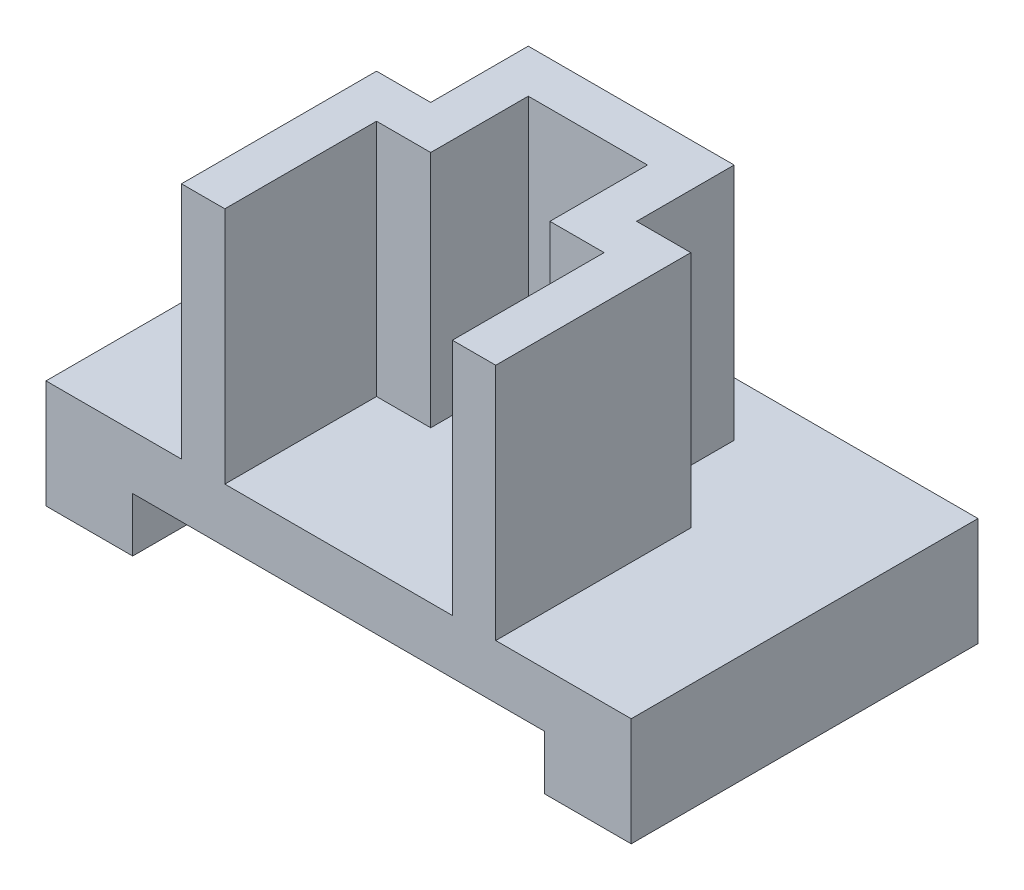
ISO-10303-21;
HEADER;
FILE_DESCRIPTION(('STEP AP214'),'2;1');
FILE_NAME('part.step','',(''),(''),'','','');
FILE_SCHEMA(('AUTOMOTIVE_DESIGN { 1 0 10303 214 1 1 1 1 }'));
ENDSEC;
DATA;
#1=APPLICATION_CONTEXT('core data for automotive mechanical design processes');
#2=APPLICATION_PROTOCOL_DEFINITION('international standard','automotive_design',2000,#1);
#3=PRODUCT_CONTEXT('',#1,'mechanical');
#4=PRODUCT('Part','Part','',(#3));
#5=PRODUCT_RELATED_PRODUCT_CATEGORY('part','',(#4));
#6=PRODUCT_DEFINITION_FORMATION('','',#4);
#7=PRODUCT_DEFINITION_CONTEXT('part definition',#1,'design');
#8=PRODUCT_DEFINITION('design','',#6,#7);
#9=PRODUCT_DEFINITION_SHAPE('','',#8);
#10=(LENGTH_UNIT() NAMED_UNIT(*) SI_UNIT(.MILLI.,.METRE.));
#11=(NAMED_UNIT(*) PLANE_ANGLE_UNIT() SI_UNIT($,.RADIAN.));
#12=(NAMED_UNIT(*) SI_UNIT($,.STERADIAN.) SOLID_ANGLE_UNIT());
#13=UNCERTAINTY_MEASURE_WITH_UNIT(LENGTH_MEASURE(1.E-05),#10,'distance_accuracy_value','');
#14=(GEOMETRIC_REPRESENTATION_CONTEXT(3) GLOBAL_UNCERTAINTY_ASSIGNED_CONTEXT((#13)) GLOBAL_UNIT_ASSIGNED_CONTEXT((#10,
#11,#12)) REPRESENTATION_CONTEXT('',''));
#15=CARTESIAN_POINT('',(0.,0.,0.));
#16=DIRECTION('',(0.,0.,1.));
#17=DIRECTION('',(1.,0.,0.));
#18=AXIS2_PLACEMENT_3D('',#15,#16,#17);
#19=CARTESIAN_POINT('',(-27.,5.,32.));
#20=DIRECTION('',(0.,-1.,0.));
#21=DIRECTION('',(0.,0.,-1.));
#22=AXIS2_PLACEMENT_3D('',#19,#20,#21);
#23=PLANE('',#22);
#24=DIRECTION('',(0.,0.,1.));
#25=VECTOR('',#24,1.);
#26=CARTESIAN_POINT('',(-14.5,5.,32.));
#27=LINE('',#26,#25);
#28=CARTESIAN_POINT('',(-14.5,5.,14.));
#29=VERTEX_POINT('',#28);
#30=CARTESIAN_POINT('',(-14.5,5.,32.));
#31=VERTEX_POINT('',#30);
#32=EDGE_CURVE('E61',#29,#31,#27,.T.);
#33=ORIENTED_EDGE('',*,*,#32,.F.);
#34=DIRECTION('',(-1.,0.,0.));
#35=VECTOR('',#34,1.);
#36=CARTESIAN_POINT('',(-14.5,5.,14.));
#37=LINE('',#36,#35);
#38=CARTESIAN_POINT('',(-9.5,5.,14.));
#39=VERTEX_POINT('',#38);
#40=EDGE_CURVE('E65',#39,#29,#37,.T.);
#41=ORIENTED_EDGE('',*,*,#40,.F.);
#42=DIRECTION('',(0.,0.,1.));
#43=VECTOR('',#42,1.);
#44=CARTESIAN_POINT('',(-9.5,5.,14.));
#45=LINE('',#44,#43);
#46=CARTESIAN_POINT('',(-9.5,5.,5.));
#47=VERTEX_POINT('',#46);
#48=EDGE_CURVE('E435',#47,#39,#45,.T.);
#49=ORIENTED_EDGE('',*,*,#48,.F.);
#50=DIRECTION('',(-1.,0.,0.));
#51=VECTOR('',#50,1.);
#52=CARTESIAN_POINT('',(-9.5,5.,5.));
#53=LINE('',#52,#51);
#54=CARTESIAN_POINT('',(9.5,5.,5.));
#55=VERTEX_POINT('',#54);
#56=EDGE_CURVE('E431',#55,#47,#53,.T.);
#57=ORIENTED_EDGE('',*,*,#56,.F.);
#58=DIRECTION('',(0.,0.,-1.));
#59=VECTOR('',#58,1.);
#60=CARTESIAN_POINT('',(9.5,5.,14.));
#61=LINE('',#60,#59);
#62=CARTESIAN_POINT('',(9.5,5.,14.));
#63=VERTEX_POINT('',#62);
#64=EDGE_CURVE('E427',#63,#55,#61,.T.);
#65=ORIENTED_EDGE('',*,*,#64,.F.);
#66=DIRECTION('',(-1.,0.,0.));
#67=VECTOR('',#66,1.);
#68=CARTESIAN_POINT('',(14.5,5.,14.));
#69=LINE('',#68,#67);
#70=CARTESIAN_POINT('',(14.5,5.,14.));
#71=VERTEX_POINT('',#70);
#72=EDGE_CURVE('E423',#71,#63,#69,.T.);
#73=ORIENTED_EDGE('',*,*,#72,.F.);
#74=DIRECTION('',(0.,0.,-1.));
#75=VECTOR('',#74,1.);
#76=CARTESIAN_POINT('',(14.5,5.,32.));
#77=LINE('',#76,#75);
#78=CARTESIAN_POINT('',(14.5,5.,32.));
#79=VERTEX_POINT('',#78);
#80=EDGE_CURVE('E419',#79,#71,#77,.T.);
#81=ORIENTED_EDGE('',*,*,#80,.F.);
#82=DIRECTION('',(-1.,0.,0.));
#83=VECTOR('',#82,1.);
#84=CARTESIAN_POINT('',(-27.,5.,32.));
#85=LINE('',#84,#83);
#86=CARTESIAN_POINT('',(27.,5.,32.));
#87=VERTEX_POINT('',#86);
#88=EDGE_CURVE('E253',#87,#79,#85,.T.);
#89=ORIENTED_EDGE('',*,*,#88,.F.);
#90=DIRECTION('',(0.,0.,-1.));
#91=VECTOR('',#90,1.);
#92=CARTESIAN_POINT('',(27.,5.,32.));
#93=LINE('',#92,#91);
#94=CARTESIAN_POINT('',(27.,5.,0.));
#95=VERTEX_POINT('',#94);
#96=EDGE_CURVE('E309',#87,#95,#93,.T.);
#97=ORIENTED_EDGE('',*,*,#96,.T.);
#98=DIRECTION('',(-1.,0.,0.));
#99=VECTOR('',#98,1.);
#100=CARTESIAN_POINT('',(-27.,5.,0.));
#101=LINE('',#100,#99);
#102=CARTESIAN_POINT('',(-27.,5.,0.));
#103=VERTEX_POINT('',#102);
#104=EDGE_CURVE('E276',#95,#103,#101,.T.);
#105=ORIENTED_EDGE('',*,*,#104,.T.);
#106=DIRECTION('',(0.,0.,-1.));
#107=VECTOR('',#106,1.);
#108=CARTESIAN_POINT('',(-27.,5.,32.));
#109=LINE('',#108,#107);
#110=CARTESIAN_POINT('',(-27.,5.,32.));
#111=VERTEX_POINT('',#110);
#112=EDGE_CURVE('E305',#111,#103,#109,.T.);
#113=ORIENTED_EDGE('',*,*,#112,.F.);
#114=EDGE_CURVE('E252',#31,#111,#85,.T.);
#115=ORIENTED_EDGE('',*,*,#114,.F.);
#116=EDGE_LOOP('',(#33,#41,#49,#57,#65,#73,#81,#89,#97,#105,#113,#115));
#117=FACE_BOUND('',#116,.T.);
#118=ADVANCED_FACE('F45',(#117),#23,.F.);
#119=DIRECTION('',(0.,0.,1.));
#120=VECTOR('',#119,1.);
#121=CARTESIAN_POINT('',(10.5,5.,32.));
#122=LINE('',#121,#120);
#123=CARTESIAN_POINT('',(10.5,5.,18.));
#124=VERTEX_POINT('',#123);
#125=CARTESIAN_POINT('',(10.5,5.,32.));
#126=VERTEX_POINT('',#125);
#127=EDGE_CURVE('E416',#124,#126,#122,.T.);
#128=ORIENTED_EDGE('',*,*,#127,.F.);
#129=DIRECTION('',(1.,0.,0.));
#130=VECTOR('',#129,1.);
#131=CARTESIAN_POINT('',(10.5,5.,18.));
#132=LINE('',#131,#130);
#133=CARTESIAN_POINT('',(5.5,5.,18.));
#134=VERTEX_POINT('',#133);
#135=EDGE_CURVE('E412',#134,#124,#132,.T.);
#136=ORIENTED_EDGE('',*,*,#135,.F.);
#137=DIRECTION('',(0.,0.,1.));
#138=VECTOR('',#137,1.);
#139=CARTESIAN_POINT('',(5.5,5.,18.));
#140=LINE('',#139,#138);
#141=CARTESIAN_POINT('',(5.5,5.,9.));
#142=VERTEX_POINT('',#141);
#143=EDGE_CURVE('E408',#142,#134,#140,.T.);
#144=ORIENTED_EDGE('',*,*,#143,.F.);
#145=DIRECTION('',(1.,0.,0.));
#146=VECTOR('',#145,1.);
#147=CARTESIAN_POINT('',(-5.5,5.,9.));
#148=LINE('',#147,#146);
#149=CARTESIAN_POINT('',(-5.5,5.,9.));
#150=VERTEX_POINT('',#149);
#151=EDGE_CURVE('E404',#150,#142,#148,.T.);
#152=ORIENTED_EDGE('',*,*,#151,.F.);
#153=DIRECTION('',(0.,0.,-1.));
#154=VECTOR('',#153,1.);
#155=CARTESIAN_POINT('',(-5.5,5.,18.));
#156=LINE('',#155,#154);
#157=CARTESIAN_POINT('',(-5.5,5.,18.));
#158=VERTEX_POINT('',#157);
#159=EDGE_CURVE('E400',#158,#150,#156,.T.);
#160=ORIENTED_EDGE('',*,*,#159,.F.);
#161=DIRECTION('',(1.,0.,0.));
#162=VECTOR('',#161,1.);
#163=CARTESIAN_POINT('',(-10.5,5.,18.));
#164=LINE('',#163,#162);
#165=CARTESIAN_POINT('',(-10.5,5.,18.));
#166=VERTEX_POINT('',#165);
#167=EDGE_CURVE('E396',#166,#158,#164,.T.);
#168=ORIENTED_EDGE('',*,*,#167,.F.);
#169=DIRECTION('',(0.,0.,-1.));
#170=VECTOR('',#169,1.);
#171=CARTESIAN_POINT('',(-10.5,5.,32.));
#172=LINE('',#171,#170);
#173=CARTESIAN_POINT('',(-10.5,5.,32.));
#174=VERTEX_POINT('',#173);
#175=EDGE_CURVE('E347',#174,#166,#172,.T.);
#176=ORIENTED_EDGE('',*,*,#175,.F.);
#177=EDGE_CURVE('E258',#126,#174,#85,.T.);
#178=ORIENTED_EDGE('',*,*,#177,.F.);
#179=EDGE_LOOP('',(#128,#136,#144,#152,#160,#168,#176,#178));
#180=FACE_BOUND('',#179,.T.);
#181=ADVANCED_FACE('F542',(#180),#23,.F.);
#182=CARTESIAN_POINT('',(19.,-5.,32.));
#183=DIRECTION('',(1.,0.,0.));
#184=DIRECTION('',(0.,0.,-1.));
#185=AXIS2_PLACEMENT_3D('',#182,#183,#184);
#186=PLANE('',#185);
#187=DIRECTION('',(0.,-1.,0.));
#188=VECTOR('',#187,1.);
#189=CARTESIAN_POINT('',(19.,-5.,0.));
#190=LINE('',#189,#188);
#191=CARTESIAN_POINT('',(19.,0.,0.));
#192=VERTEX_POINT('',#191);
#193=CARTESIAN_POINT('',(19.,-5.,0.));
#194=VERTEX_POINT('',#193);
#195=EDGE_CURVE('E231',#192,#194,#190,.T.);
#196=ORIENTED_EDGE('',*,*,#195,.T.);
#197=DIRECTION('',(0.,0.,-1.));
#198=VECTOR('',#197,1.);
#199=CARTESIAN_POINT('',(19.,-5.,32.));
#200=LINE('',#199,#198);
#201=CARTESIAN_POINT('',(19.,-5.,32.));
#202=VERTEX_POINT('',#201);
#203=EDGE_CURVE('E11',#202,#194,#200,.T.);
#204=ORIENTED_EDGE('',*,*,#203,.F.);
#205=DIRECTION('',(0.,-1.,0.));
#206=VECTOR('',#205,1.);
#207=CARTESIAN_POINT('',(19.,-5.,32.));
#208=LINE('',#207,#206);
#209=CARTESIAN_POINT('',(19.,0.,32.));
#210=VERTEX_POINT('',#209);
#211=EDGE_CURVE('E242',#210,#202,#208,.T.);
#212=ORIENTED_EDGE('',*,*,#211,.F.);
#213=DIRECTION('',(0.,0.,-1.));
#214=VECTOR('',#213,1.);
#215=CARTESIAN_POINT('',(19.,0.,32.));
#216=LINE('',#215,#214);
#217=EDGE_CURVE('E269',#210,#192,#216,.T.);
#218=ORIENTED_EDGE('',*,*,#217,.T.);
#219=EDGE_LOOP('',(#196,#204,#212,#218));
#220=FACE_BOUND('',#219,.T.);
#221=ADVANCED_FACE('F47',(#220),#186,.F.);
#222=CARTESIAN_POINT('',(19.,-5.,32.));
#223=DIRECTION('',(0.,1.,0.));
#224=DIRECTION('',(0.,0.,1.));
#225=AXIS2_PLACEMENT_3D('',#222,#223,#224);
#226=PLANE('',#225);
#227=DIRECTION('',(1.,0.,0.));
#228=VECTOR('',#227,1.);
#229=CARTESIAN_POINT('',(19.,-5.,0.));
#230=LINE('',#229,#228);
#231=CARTESIAN_POINT('',(27.,-5.,0.));
#232=VERTEX_POINT('',#231);
#233=EDGE_CURVE('E236',#194,#232,#230,.T.);
#234=ORIENTED_EDGE('',*,*,#233,.T.);
#235=DIRECTION('',(0.,0.,-1.));
#236=VECTOR('',#235,1.);
#237=CARTESIAN_POINT('',(27.,-5.,32.));
#238=LINE('',#237,#236);
#239=CARTESIAN_POINT('',(27.,-5.,32.));
#240=VERTEX_POINT('',#239);
#241=EDGE_CURVE('E54',#240,#232,#238,.T.);
#242=ORIENTED_EDGE('',*,*,#241,.F.);
#243=DIRECTION('',(1.,0.,0.));
#244=VECTOR('',#243,1.);
#245=CARTESIAN_POINT('',(19.,-5.,32.));
#246=LINE('',#245,#244);
#247=EDGE_CURVE('E245',#202,#240,#246,.T.);
#248=ORIENTED_EDGE('',*,*,#247,.F.);
#249=ORIENTED_EDGE('',*,*,#203,.T.);
#250=EDGE_LOOP('',(#234,#242,#248,#249));
#251=FACE_BOUND('',#250,.T.);
#252=ADVANCED_FACE('F552',(#251),#226,.F.);
#253=CARTESIAN_POINT('',(27.,-5.,32.));
#254=DIRECTION('',(-1.,0.,0.));
#255=DIRECTION('',(0.,0.,1.));
#256=AXIS2_PLACEMENT_3D('',#253,#254,#255);
#257=PLANE('',#256);
#258=DIRECTION('',(0.,1.,0.));
#259=VECTOR('',#258,1.);
#260=CARTESIAN_POINT('',(27.,-5.,0.));
#261=LINE('',#260,#259);
#262=EDGE_CURVE('E273',#232,#95,#261,.T.);
#263=ORIENTED_EDGE('',*,*,#262,.T.);
#264=ORIENTED_EDGE('',*,*,#96,.F.);
#265=DIRECTION('',(0.,1.,0.));
#266=VECTOR('',#265,1.);
#267=CARTESIAN_POINT('',(27.,-5.,32.));
#268=LINE('',#267,#266);
#269=EDGE_CURVE('E249',#240,#87,#268,.T.);
#270=ORIENTED_EDGE('',*,*,#269,.F.);
#271=ORIENTED_EDGE('',*,*,#241,.T.);
#272=EDGE_LOOP('',(#263,#264,#270,#271));
#273=FACE_BOUND('',#272,.T.);
#274=ADVANCED_FACE('F318',(#273),#257,.F.);
#275=CARTESIAN_POINT('',(-27.,-5.,32.));
#276=DIRECTION('',(1.,0.,0.));
#277=DIRECTION('',(0.,0.,-1.));
#278=AXIS2_PLACEMENT_3D('',#275,#276,#277);
#279=PLANE('',#278);
#280=DIRECTION('',(0.,-1.,0.));
#281=VECTOR('',#280,1.);
#282=CARTESIAN_POINT('',(-27.,-5.,0.));
#283=LINE('',#282,#281);
#284=CARTESIAN_POINT('',(-27.,-5.,0.));
#285=VERTEX_POINT('',#284);
#286=EDGE_CURVE('E279',#103,#285,#283,.T.);
#287=ORIENTED_EDGE('',*,*,#286,.T.);
#288=DIRECTION('',(0.,0.,-1.));
#289=VECTOR('',#288,1.);
#290=CARTESIAN_POINT('',(-27.,-5.,32.));
#291=LINE('',#290,#289);
#292=CARTESIAN_POINT('',(-27.,-5.,32.));
#293=VERTEX_POINT('',#292);
#294=EDGE_CURVE('E301',#293,#285,#291,.T.);
#295=ORIENTED_EDGE('',*,*,#294,.F.);
#296=DIRECTION('',(0.,-1.,0.));
#297=VECTOR('',#296,1.);
#298=CARTESIAN_POINT('',(-27.,-5.,32.));
#299=LINE('',#298,#297);
#300=EDGE_CURVE('E257',#111,#293,#299,.T.);
#301=ORIENTED_EDGE('',*,*,#300,.F.);
#302=ORIENTED_EDGE('',*,*,#112,.T.);
#303=EDGE_LOOP('',(#287,#295,#301,#302));
#304=FACE_BOUND('',#303,.T.);
#305=ADVANCED_FACE('F331',(#304),#279,.F.);
#306=CARTESIAN_POINT('',(-19.,-5.,32.));
#307=DIRECTION('',(0.,1.,0.));
#308=DIRECTION('',(-1.,0.,0.));
#309=AXIS2_PLACEMENT_3D('',#306,#307,#308);
#310=PLANE('',#309);
#311=DIRECTION('',(1.,0.,0.));
#312=VECTOR('',#311,1.);
#313=CARTESIAN_POINT('',(-19.,-5.,0.));
#314=LINE('',#313,#312);
#315=CARTESIAN_POINT('',(-19.,-5.,0.));
#316=VERTEX_POINT('',#315);
#317=EDGE_CURVE('E282',#285,#316,#314,.T.);
#318=ORIENTED_EDGE('',*,*,#317,.T.);
#319=DIRECTION('',(0.,0.,-1.));
#320=VECTOR('',#319,1.);
#321=CARTESIAN_POINT('',(-19.,-5.,32.));
#322=LINE('',#321,#320);
#323=CARTESIAN_POINT('',(-19.,-5.,32.));
#324=VERTEX_POINT('',#323);
#325=EDGE_CURVE('E297',#324,#316,#322,.T.);
#326=ORIENTED_EDGE('',*,*,#325,.F.);
#327=DIRECTION('',(1.,0.,0.));
#328=VECTOR('',#327,1.);
#329=CARTESIAN_POINT('',(-19.,-5.,32.));
#330=LINE('',#329,#328);
#331=EDGE_CURVE('E261',#293,#324,#330,.T.);
#332=ORIENTED_EDGE('',*,*,#331,.F.);
#333=ORIENTED_EDGE('',*,*,#294,.T.);
#334=EDGE_LOOP('',(#318,#326,#332,#333));
#335=FACE_BOUND('',#334,.T.);
#336=ADVANCED_FACE('F571',(#335),#310,.F.);
#337=CARTESIAN_POINT('',(-19.,-5.,32.));
#338=DIRECTION('',(-1.,0.,0.));
#339=DIRECTION('',(0.,0.,1.));
#340=AXIS2_PLACEMENT_3D('',#337,#338,#339);
#341=PLANE('',#340);
#342=DIRECTION('',(0.,1.,0.));
#343=VECTOR('',#342,1.);
#344=CARTESIAN_POINT('',(-19.,-5.,0.));
#345=LINE('',#344,#343);
#346=CARTESIAN_POINT('',(-19.,0.,0.));
#347=VERTEX_POINT('',#346);
#348=EDGE_CURVE('E285',#316,#347,#345,.T.);
#349=ORIENTED_EDGE('',*,*,#348,.T.);
#350=DIRECTION('',(0.,0.,-1.));
#351=VECTOR('',#350,1.);
#352=CARTESIAN_POINT('',(-19.,0.,32.));
#353=LINE('',#352,#351);
#354=CARTESIAN_POINT('',(-19.,0.,32.));
#355=VERTEX_POINT('',#354);
#356=EDGE_CURVE('E293',#355,#347,#353,.T.);
#357=ORIENTED_EDGE('',*,*,#356,.F.);
#358=DIRECTION('',(0.,1.,0.));
#359=VECTOR('',#358,1.);
#360=CARTESIAN_POINT('',(-19.,-5.,32.));
#361=LINE('',#360,#359);
#362=EDGE_CURVE('E264',#324,#355,#361,.T.);
#363=ORIENTED_EDGE('',*,*,#362,.F.);
#364=ORIENTED_EDGE('',*,*,#325,.T.);
#365=EDGE_LOOP('',(#349,#357,#363,#364));
#366=FACE_BOUND('',#365,.T.);
#367=ADVANCED_FACE('F569',(#366),#341,.F.);
#368=CARTESIAN_POINT('',(-19.,0.,32.));
#369=DIRECTION('',(0.,1.,0.));
#370=DIRECTION('',(-1.,0.,0.));
#371=AXIS2_PLACEMENT_3D('',#368,#369,#370);
#372=PLANE('',#371);
#373=DIRECTION('',(1.,0.,0.));
#374=VECTOR('',#373,1.);
#375=CARTESIAN_POINT('',(-19.,0.,0.));
#376=LINE('',#375,#374);
#377=EDGE_CURVE('E246',#347,#192,#376,.T.);
#378=ORIENTED_EDGE('',*,*,#377,.T.);
#379=ORIENTED_EDGE('',*,*,#217,.F.);
#380=DIRECTION('',(1.,0.,0.));
#381=VECTOR('',#380,1.);
#382=CARTESIAN_POINT('',(-19.,0.,32.));
#383=LINE('',#382,#381);
#384=EDGE_CURVE('E267',#355,#210,#383,.T.);
#385=ORIENTED_EDGE('',*,*,#384,.F.);
#386=ORIENTED_EDGE('',*,*,#356,.T.);
#387=EDGE_LOOP('',(#378,#379,#385,#386));
#388=FACE_BOUND('',#387,.T.);
#389=ADVANCED_FACE('F564',(#388),#372,.F.);
#390=CARTESIAN_POINT('',(0.,0.,32.));
#391=DIRECTION('',(0.,0.,-1.));
#392=DIRECTION('',(-1.,0.,0.));
#393=AXIS2_PLACEMENT_3D('',#390,#391,#392);
#394=PLANE('',#393);
#395=ORIENTED_EDGE('',*,*,#211,.T.);
#396=ORIENTED_EDGE('',*,*,#247,.T.);
#397=ORIENTED_EDGE('',*,*,#269,.T.);
#398=ORIENTED_EDGE('',*,*,#88,.T.);
#399=DIRECTION('',(0.,-1.,0.));
#400=VECTOR('',#399,1.);
#401=CARTESIAN_POINT('',(14.5,27.,32.));
#402=LINE('',#401,#400);
#403=CARTESIAN_POINT('',(14.5,27.,32.));
#404=VERTEX_POINT('',#403);
#405=EDGE_CURVE('E462',#404,#79,#402,.T.);
#406=ORIENTED_EDGE('',*,*,#405,.F.);
#407=DIRECTION('',(1.,0.,0.));
#408=VECTOR('',#407,1.);
#409=CARTESIAN_POINT('',(14.5,27.,32.));
#410=LINE('',#409,#408);
#411=CARTESIAN_POINT('',(10.5,27.,32.));
#412=VERTEX_POINT('',#411);
#413=EDGE_CURVE('E371',#412,#404,#410,.T.);
#414=ORIENTED_EDGE('',*,*,#413,.F.);
#415=DIRECTION('',(0.,-1.,0.));
#416=VECTOR('',#415,1.);
#417=CARTESIAN_POINT('',(10.5,27.,32.));
#418=LINE('',#417,#416);
#419=EDGE_CURVE('E340',#412,#126,#418,.T.);
#420=ORIENTED_EDGE('',*,*,#419,.T.);
#421=ORIENTED_EDGE('',*,*,#177,.T.);
#422=DIRECTION('',(0.,-1.,0.));
#423=VECTOR('',#422,1.);
#424=CARTESIAN_POINT('',(-10.5,27.,32.));
#425=LINE('',#424,#423);
#426=CARTESIAN_POINT('',(-10.5,27.,32.));
#427=VERTEX_POINT('',#426);
#428=EDGE_CURVE('E213',#427,#174,#425,.T.);
#429=ORIENTED_EDGE('',*,*,#428,.F.);
#430=DIRECTION('',(1.,0.,0.));
#431=VECTOR('',#430,1.);
#432=CARTESIAN_POINT('',(-14.5,27.,32.));
#433=LINE('',#432,#431);
#434=CARTESIAN_POINT('',(-14.5,27.,32.));
#435=VERTEX_POINT('',#434);
#436=EDGE_CURVE('E205',#435,#427,#433,.T.);
#437=ORIENTED_EDGE('',*,*,#436,.F.);
#438=DIRECTION('',(0.,-1.,0.));
#439=VECTOR('',#438,1.);
#440=CARTESIAN_POINT('',(-14.5,27.,32.));
#441=LINE('',#440,#439);
#442=EDGE_CURVE('E210',#435,#31,#441,.T.);
#443=ORIENTED_EDGE('',*,*,#442,.T.);
#444=ORIENTED_EDGE('',*,*,#114,.T.);
#445=ORIENTED_EDGE('',*,*,#300,.T.);
#446=ORIENTED_EDGE('',*,*,#331,.T.);
#447=ORIENTED_EDGE('',*,*,#362,.T.);
#448=ORIENTED_EDGE('',*,*,#384,.T.);
#449=EDGE_LOOP('',(#395,#396,#397,#398,#406,#414,#420,#421,#429,#437,#443,#444,#445,#446,#447,#448));
#450=FACE_BOUND('',#449,.T.);
#451=ADVANCED_FACE('F208',(#450),#394,.F.);
#452=CARTESIAN_POINT('',(0.,0.,0.));
#453=DIRECTION('',(0.,0.,-1.));
#454=DIRECTION('',(-1.,0.,0.));
#455=AXIS2_PLACEMENT_3D('',#452,#453,#454);
#456=PLANE('',#455);
#457=ORIENTED_EDGE('',*,*,#195,.F.);
#458=ORIENTED_EDGE('',*,*,#377,.F.);
#459=ORIENTED_EDGE('',*,*,#348,.F.);
#460=ORIENTED_EDGE('',*,*,#317,.F.);
#461=ORIENTED_EDGE('',*,*,#286,.F.);
#462=ORIENTED_EDGE('',*,*,#104,.F.);
#463=ORIENTED_EDGE('',*,*,#262,.F.);
#464=ORIENTED_EDGE('',*,*,#233,.F.);
#465=EDGE_LOOP('',(#457,#458,#459,#460,#461,#462,#463,#464));
#466=FACE_BOUND('',#465,.T.);
#467=ADVANCED_FACE('F324',(#466),#456,.T.);
#468=CARTESIAN_POINT('',(-14.5,27.,32.));
#469=DIRECTION('',(1.,0.,0.));
#470=DIRECTION('',(0.,0.,-1.));
#471=AXIS2_PLACEMENT_3D('',#468,#469,#470);
#472=PLANE('',#471);
#473=ORIENTED_EDGE('',*,*,#32,.T.);
#474=ORIENTED_EDGE('',*,*,#442,.F.);
#475=DIRECTION('',(0.,0.,1.));
#476=VECTOR('',#475,1.);
#477=CARTESIAN_POINT('',(-14.5,27.,32.));
#478=LINE('',#477,#476);
#479=CARTESIAN_POINT('',(-14.5,27.,14.));
#480=VERTEX_POINT('',#479);
#481=EDGE_CURVE('E218',#480,#435,#478,.T.);
#482=ORIENTED_EDGE('',*,*,#481,.F.);
#483=DIRECTION('',(0.,-1.,0.));
#484=VECTOR('',#483,1.);
#485=CARTESIAN_POINT('',(-14.5,27.,14.));
#486=LINE('',#485,#484);
#487=EDGE_CURVE('E391',#480,#29,#486,.T.);
#488=ORIENTED_EDGE('',*,*,#487,.T.);
#489=EDGE_LOOP('',(#473,#474,#482,#488));
#490=FACE_BOUND('',#489,.T.);
#491=ADVANCED_FACE('F229',(#490),#472,.F.);
#492=CARTESIAN_POINT('',(-10.5,27.,32.));
#493=DIRECTION('',(-1.,0.,0.));
#494=DIRECTION('',(0.,0.,1.));
#495=AXIS2_PLACEMENT_3D('',#492,#493,#494);
#496=PLANE('',#495);
#497=ORIENTED_EDGE('',*,*,#175,.T.);
#498=DIRECTION('',(0.,-1.,0.));
#499=VECTOR('',#498,1.);
#500=CARTESIAN_POINT('',(-10.5,27.,18.));
#501=LINE('',#500,#499);
#502=CARTESIAN_POINT('',(-10.5,27.,18.));
#503=VERTEX_POINT('',#502);
#504=EDGE_CURVE('E238',#503,#166,#501,.T.);
#505=ORIENTED_EDGE('',*,*,#504,.F.);
#506=DIRECTION('',(0.,0.,-1.));
#507=VECTOR('',#506,1.);
#508=CARTESIAN_POINT('',(-10.5,27.,32.));
#509=LINE('',#508,#507);
#510=EDGE_CURVE('E217',#427,#503,#509,.T.);
#511=ORIENTED_EDGE('',*,*,#510,.F.);
#512=ORIENTED_EDGE('',*,*,#428,.T.);
#513=EDGE_LOOP('',(#497,#505,#511,#512));
#514=FACE_BOUND('',#513,.T.);
#515=ADVANCED_FACE('F345',(#514),#496,.F.);
#516=CARTESIAN_POINT('',(-10.5,27.,18.));
#517=DIRECTION('',(0.,0.,-1.));
#518=DIRECTION('',(-1.,0.,0.));
#519=AXIS2_PLACEMENT_3D('',#516,#517,#518);
#520=PLANE('',#519);
#521=ORIENTED_EDGE('',*,*,#167,.T.);
#522=DIRECTION('',(0.,-1.,0.));
#523=VECTOR('',#522,1.);
#524=CARTESIAN_POINT('',(-5.5,27.,18.));
#525=LINE('',#524,#523);
#526=CARTESIAN_POINT('',(-5.5,27.,18.));
#527=VERTEX_POINT('',#526);
#528=EDGE_CURVE('E484',#527,#158,#525,.T.);
#529=ORIENTED_EDGE('',*,*,#528,.F.);
#530=DIRECTION('',(1.,0.,0.));
#531=VECTOR('',#530,1.);
#532=CARTESIAN_POINT('',(-10.5,27.,18.));
#533=LINE('',#532,#531);
#534=EDGE_CURVE('E351',#503,#527,#533,.T.);
#535=ORIENTED_EDGE('',*,*,#534,.F.);
#536=ORIENTED_EDGE('',*,*,#504,.T.);
#537=EDGE_LOOP('',(#521,#529,#535,#536));
#538=FACE_BOUND('',#537,.T.);
#539=ADVANCED_FACE('F489',(#538),#520,.F.);
#540=CARTESIAN_POINT('',(-5.5,27.,18.));
#541=DIRECTION('',(-1.,0.,0.));
#542=DIRECTION('',(0.,0.,1.));
#543=AXIS2_PLACEMENT_3D('',#540,#541,#542);
#544=PLANE('',#543);
#545=ORIENTED_EDGE('',*,*,#159,.T.);
#546=DIRECTION('',(0.,-1.,0.));
#547=VECTOR('',#546,1.);
#548=CARTESIAN_POINT('',(-5.5,27.,9.));
#549=LINE('',#548,#547);
#550=CARTESIAN_POINT('',(-5.5,27.,9.));
#551=VERTEX_POINT('',#550);
#552=EDGE_CURVE('E480',#551,#150,#549,.T.);
#553=ORIENTED_EDGE('',*,*,#552,.F.);
#554=DIRECTION('',(0.,0.,-1.));
#555=VECTOR('',#554,1.);
#556=CARTESIAN_POINT('',(-5.5,27.,18.));
#557=LINE('',#556,#555);
#558=EDGE_CURVE('E354',#527,#551,#557,.T.);
#559=ORIENTED_EDGE('',*,*,#558,.F.);
#560=ORIENTED_EDGE('',*,*,#528,.T.);
#561=EDGE_LOOP('',(#545,#553,#559,#560));
#562=FACE_BOUND('',#561,.T.);
#563=ADVANCED_FACE('F496',(#562),#544,.F.);
#564=CARTESIAN_POINT('',(-5.5,27.,9.));
#565=DIRECTION('',(0.,0.,-1.));
#566=DIRECTION('',(-1.,0.,0.));
#567=AXIS2_PLACEMENT_3D('',#564,#565,#566);
#568=PLANE('',#567);
#569=ORIENTED_EDGE('',*,*,#151,.T.);
#570=DIRECTION('',(0.,-1.,0.));
#571=VECTOR('',#570,1.);
#572=CARTESIAN_POINT('',(5.5,27.,9.));
#573=LINE('',#572,#571);
#574=CARTESIAN_POINT('',(5.5,27.,9.));
#575=VERTEX_POINT('',#574);
#576=EDGE_CURVE('E476',#575,#142,#573,.T.);
#577=ORIENTED_EDGE('',*,*,#576,.F.);
#578=DIRECTION('',(1.,0.,0.));
#579=VECTOR('',#578,1.);
#580=CARTESIAN_POINT('',(-5.5,27.,9.));
#581=LINE('',#580,#579);
#582=EDGE_CURVE('E359',#551,#575,#581,.T.);
#583=ORIENTED_EDGE('',*,*,#582,.F.);
#584=ORIENTED_EDGE('',*,*,#552,.T.);
#585=EDGE_LOOP('',(#569,#577,#583,#584));
#586=FACE_BOUND('',#585,.T.);
#587=ADVANCED_FACE('F498',(#586),#568,.F.);
#588=CARTESIAN_POINT('',(5.5,27.,18.));
#589=DIRECTION('',(1.,0.,0.));
#590=DIRECTION('',(0.,0.,-1.));
#591=AXIS2_PLACEMENT_3D('',#588,#589,#590);
#592=PLANE('',#591);
#593=ORIENTED_EDGE('',*,*,#143,.T.);
#594=DIRECTION('',(0.,-1.,0.));
#595=VECTOR('',#594,1.);
#596=CARTESIAN_POINT('',(5.5,27.,18.));
#597=LINE('',#596,#595);
#598=CARTESIAN_POINT('',(5.5,27.,18.));
#599=VERTEX_POINT('',#598);
#600=EDGE_CURVE('E472',#599,#134,#597,.T.);
#601=ORIENTED_EDGE('',*,*,#600,.F.);
#602=DIRECTION('',(0.,0.,1.));
#603=VECTOR('',#602,1.);
#604=CARTESIAN_POINT('',(5.5,27.,18.));
#605=LINE('',#604,#603);
#606=EDGE_CURVE('E362',#575,#599,#605,.T.);
#607=ORIENTED_EDGE('',*,*,#606,.F.);
#608=ORIENTED_EDGE('',*,*,#576,.T.);
#609=EDGE_LOOP('',(#593,#601,#607,#608));
#610=FACE_BOUND('',#609,.T.);
#611=ADVANCED_FACE('F502',(#610),#592,.F.);
#612=CARTESIAN_POINT('',(10.5,27.,18.));
#613=DIRECTION('',(0.,0.,-1.));
#614=DIRECTION('',(-1.,0.,0.));
#615=AXIS2_PLACEMENT_3D('',#612,#613,#614);
#616=PLANE('',#615);
#617=ORIENTED_EDGE('',*,*,#135,.T.);
#618=DIRECTION('',(0.,-1.,0.));
#619=VECTOR('',#618,1.);
#620=CARTESIAN_POINT('',(10.5,27.,18.));
#621=LINE('',#620,#619);
#622=CARTESIAN_POINT('',(10.5,27.,18.));
#623=VERTEX_POINT('',#622);
#624=EDGE_CURVE('E468',#623,#124,#621,.T.);
#625=ORIENTED_EDGE('',*,*,#624,.F.);
#626=DIRECTION('',(1.,0.,0.));
#627=VECTOR('',#626,1.);
#628=CARTESIAN_POINT('',(10.5,27.,18.));
#629=LINE('',#628,#627);
#630=EDGE_CURVE('E365',#599,#623,#629,.T.);
#631=ORIENTED_EDGE('',*,*,#630,.F.);
#632=ORIENTED_EDGE('',*,*,#600,.T.);
#633=EDGE_LOOP('',(#617,#625,#631,#632));
#634=FACE_BOUND('',#633,.T.);
#635=ADVANCED_FACE('F507',(#634),#616,.F.);
#636=CARTESIAN_POINT('',(10.5,27.,32.));
#637=DIRECTION('',(1.,0.,0.));
#638=DIRECTION('',(0.,0.,-1.));
#639=AXIS2_PLACEMENT_3D('',#636,#637,#638);
#640=PLANE('',#639);
#641=ORIENTED_EDGE('',*,*,#127,.T.);
#642=ORIENTED_EDGE('',*,*,#419,.F.);
#643=DIRECTION('',(0.,0.,1.));
#644=VECTOR('',#643,1.);
#645=CARTESIAN_POINT('',(10.5,27.,32.));
#646=LINE('',#645,#644);
#647=EDGE_CURVE('E368',#623,#412,#646,.T.);
#648=ORIENTED_EDGE('',*,*,#647,.F.);
#649=ORIENTED_EDGE('',*,*,#624,.T.);
#650=EDGE_LOOP('',(#641,#642,#648,#649));
#651=FACE_BOUND('',#650,.T.);
#652=ADVANCED_FACE('F509',(#651),#640,.F.);
#653=CARTESIAN_POINT('',(14.5,27.,32.));
#654=DIRECTION('',(-1.,0.,0.));
#655=DIRECTION('',(0.,0.,1.));
#656=AXIS2_PLACEMENT_3D('',#653,#654,#655);
#657=PLANE('',#656);
#658=ORIENTED_EDGE('',*,*,#80,.T.);
#659=DIRECTION('',(0.,-1.,0.));
#660=VECTOR('',#659,1.);
#661=CARTESIAN_POINT('',(14.5,27.,14.));
#662=LINE('',#661,#660);
#663=CARTESIAN_POINT('',(14.5,27.,14.));
#664=VERTEX_POINT('',#663);
#665=EDGE_CURVE('E458',#664,#71,#662,.T.);
#666=ORIENTED_EDGE('',*,*,#665,.F.);
#667=DIRECTION('',(0.,0.,-1.));
#668=VECTOR('',#667,1.);
#669=CARTESIAN_POINT('',(14.5,27.,32.));
#670=LINE('',#669,#668);
#671=EDGE_CURVE('E374',#404,#664,#670,.T.);
#672=ORIENTED_EDGE('',*,*,#671,.F.);
#673=ORIENTED_EDGE('',*,*,#405,.T.);
#674=EDGE_LOOP('',(#658,#666,#672,#673));
#675=FACE_BOUND('',#674,.T.);
#676=ADVANCED_FACE('F516',(#675),#657,.F.);
#677=CARTESIAN_POINT('',(14.5,27.,14.));
#678=DIRECTION('',(0.,0.,1.));
#679=DIRECTION('',(1.,0.,0.));
#680=AXIS2_PLACEMENT_3D('',#677,#678,#679);
#681=PLANE('',#680);
#682=ORIENTED_EDGE('',*,*,#72,.T.);
#683=DIRECTION('',(0.,-1.,0.));
#684=VECTOR('',#683,1.);
#685=CARTESIAN_POINT('',(9.5,27.,14.));
#686=LINE('',#685,#684);
#687=CARTESIAN_POINT('',(9.5,27.,14.));
#688=VERTEX_POINT('',#687);
#689=EDGE_CURVE('E454',#688,#63,#686,.T.);
#690=ORIENTED_EDGE('',*,*,#689,.F.);
#691=DIRECTION('',(-1.,0.,0.));
#692=VECTOR('',#691,1.);
#693=CARTESIAN_POINT('',(14.5,27.,14.));
#694=LINE('',#693,#692);
#695=EDGE_CURVE('E377',#664,#688,#694,.T.);
#696=ORIENTED_EDGE('',*,*,#695,.F.);
#697=ORIENTED_EDGE('',*,*,#665,.T.);
#698=EDGE_LOOP('',(#682,#690,#696,#697));
#699=FACE_BOUND('',#698,.T.);
#700=ADVANCED_FACE('F518',(#699),#681,.F.);
#701=CARTESIAN_POINT('',(9.5,27.,14.));
#702=DIRECTION('',(-1.,0.,0.));
#703=DIRECTION('',(0.,0.,1.));
#704=AXIS2_PLACEMENT_3D('',#701,#702,#703);
#705=PLANE('',#704);
#706=ORIENTED_EDGE('',*,*,#64,.T.);
#707=DIRECTION('',(0.,-1.,0.));
#708=VECTOR('',#707,1.);
#709=CARTESIAN_POINT('',(9.5,27.,5.));
#710=LINE('',#709,#708);
#711=CARTESIAN_POINT('',(9.5,27.,5.));
#712=VERTEX_POINT('',#711);
#713=EDGE_CURVE('E450',#712,#55,#710,.T.);
#714=ORIENTED_EDGE('',*,*,#713,.F.);
#715=DIRECTION('',(0.,0.,-1.));
#716=VECTOR('',#715,1.);
#717=CARTESIAN_POINT('',(9.5,27.,14.));
#718=LINE('',#717,#716);
#719=EDGE_CURVE('E380',#688,#712,#718,.T.);
#720=ORIENTED_EDGE('',*,*,#719,.F.);
#721=ORIENTED_EDGE('',*,*,#689,.T.);
#722=EDGE_LOOP('',(#706,#714,#720,#721));
#723=FACE_BOUND('',#722,.T.);
#724=ADVANCED_FACE('F522',(#723),#705,.F.);
#725=CARTESIAN_POINT('',(-9.5,27.,5.));
#726=DIRECTION('',(0.,0.,1.));
#727=DIRECTION('',(1.,0.,0.));
#728=AXIS2_PLACEMENT_3D('',#725,#726,#727);
#729=PLANE('',#728);
#730=ORIENTED_EDGE('',*,*,#56,.T.);
#731=DIRECTION('',(0.,-1.,0.));
#732=VECTOR('',#731,1.);
#733=CARTESIAN_POINT('',(-9.5,27.,5.));
#734=LINE('',#733,#732);
#735=CARTESIAN_POINT('',(-9.5,27.,5.));
#736=VERTEX_POINT('',#735);
#737=EDGE_CURVE('E446',#736,#47,#734,.T.);
#738=ORIENTED_EDGE('',*,*,#737,.F.);
#739=DIRECTION('',(-1.,0.,0.));
#740=VECTOR('',#739,1.);
#741=CARTESIAN_POINT('',(-9.5,27.,5.));
#742=LINE('',#741,#740);
#743=EDGE_CURVE('E383',#712,#736,#742,.T.);
#744=ORIENTED_EDGE('',*,*,#743,.F.);
#745=ORIENTED_EDGE('',*,*,#713,.T.);
#746=EDGE_LOOP('',(#730,#738,#744,#745));
#747=FACE_BOUND('',#746,.T.);
#748=ADVANCED_FACE('F528',(#747),#729,.F.);
#749=CARTESIAN_POINT('',(-9.5,27.,14.));
#750=DIRECTION('',(1.,0.,0.));
#751=DIRECTION('',(0.,0.,-1.));
#752=AXIS2_PLACEMENT_3D('',#749,#750,#751);
#753=PLANE('',#752);
#754=ORIENTED_EDGE('',*,*,#48,.T.);
#755=DIRECTION('',(0.,-1.,0.));
#756=VECTOR('',#755,1.);
#757=CARTESIAN_POINT('',(-9.5,27.,14.));
#758=LINE('',#757,#756);
#759=CARTESIAN_POINT('',(-9.5,27.,14.));
#760=VERTEX_POINT('',#759);
#761=EDGE_CURVE('E442',#760,#39,#758,.T.);
#762=ORIENTED_EDGE('',*,*,#761,.F.);
#763=DIRECTION('',(0.,0.,1.));
#764=VECTOR('',#763,1.);
#765=CARTESIAN_POINT('',(-9.5,27.,14.));
#766=LINE('',#765,#764);
#767=EDGE_CURVE('E386',#736,#760,#766,.T.);
#768=ORIENTED_EDGE('',*,*,#767,.F.);
#769=ORIENTED_EDGE('',*,*,#737,.T.);
#770=EDGE_LOOP('',(#754,#762,#768,#769));
#771=FACE_BOUND('',#770,.T.);
#772=ADVANCED_FACE('F530',(#771),#753,.F.);
#773=CARTESIAN_POINT('',(-14.5,27.,14.));
#774=DIRECTION('',(0.,0.,1.));
#775=DIRECTION('',(1.,0.,0.));
#776=AXIS2_PLACEMENT_3D('',#773,#774,#775);
#777=PLANE('',#776);
#778=ORIENTED_EDGE('',*,*,#40,.T.);
#779=ORIENTED_EDGE('',*,*,#487,.F.);
#780=DIRECTION('',(-1.,0.,0.));
#781=VECTOR('',#780,1.);
#782=CARTESIAN_POINT('',(-14.5,27.,14.));
#783=LINE('',#782,#781);
#784=EDGE_CURVE('E223',#760,#480,#783,.T.);
#785=ORIENTED_EDGE('',*,*,#784,.F.);
#786=ORIENTED_EDGE('',*,*,#761,.T.);
#787=EDGE_LOOP('',(#778,#779,#785,#786));
#788=FACE_BOUND('',#787,.T.);
#789=ADVANCED_FACE('F532',(#788),#777,.F.);
#790=CARTESIAN_POINT('',(0.,27.,0.));
#791=DIRECTION('',(0.,-1.,0.));
#792=DIRECTION('',(0.,0.,-1.));
#793=AXIS2_PLACEMENT_3D('',#790,#791,#792);
#794=PLANE('',#793);
#795=ORIENTED_EDGE('',*,*,#481,.T.);
#796=ORIENTED_EDGE('',*,*,#436,.T.);
#797=ORIENTED_EDGE('',*,*,#510,.T.);
#798=ORIENTED_EDGE('',*,*,#534,.T.);
#799=ORIENTED_EDGE('',*,*,#558,.T.);
#800=ORIENTED_EDGE('',*,*,#582,.T.);
#801=ORIENTED_EDGE('',*,*,#606,.T.);
#802=ORIENTED_EDGE('',*,*,#630,.T.);
#803=ORIENTED_EDGE('',*,*,#647,.T.);
#804=ORIENTED_EDGE('',*,*,#413,.T.);
#805=ORIENTED_EDGE('',*,*,#671,.T.);
#806=ORIENTED_EDGE('',*,*,#695,.T.);
#807=ORIENTED_EDGE('',*,*,#719,.T.);
#808=ORIENTED_EDGE('',*,*,#743,.T.);
#809=ORIENTED_EDGE('',*,*,#767,.T.);
#810=ORIENTED_EDGE('',*,*,#784,.T.);
#811=EDGE_LOOP('',(#795,#796,#797,#798,#799,#800,#801,#802,#803,#804,#805,#806,#807,#808,#809,#810));
#812=FACE_BOUND('',#811,.T.);
#813=ADVANCED_FACE('F221',(#812),#794,.F.);
#814=CLOSED_SHELL('',(#118,#181,#221,#252,#274,#305,#336,#367,#389,#451,#467,#491,#515,#539,
#563,#587,#611,#635,#652,#676,#700,#724,#748,#772,#789,#813));
#815=MANIFOLD_SOLID_BREP('B2',#814);
#816=ADVANCED_BREP_SHAPE_REPRESENTATION('',(#18,#815),#14);
#817=SHAPE_DEFINITION_REPRESENTATION(#9,#816);
ENDSEC;
END-ISO-10303-21;
